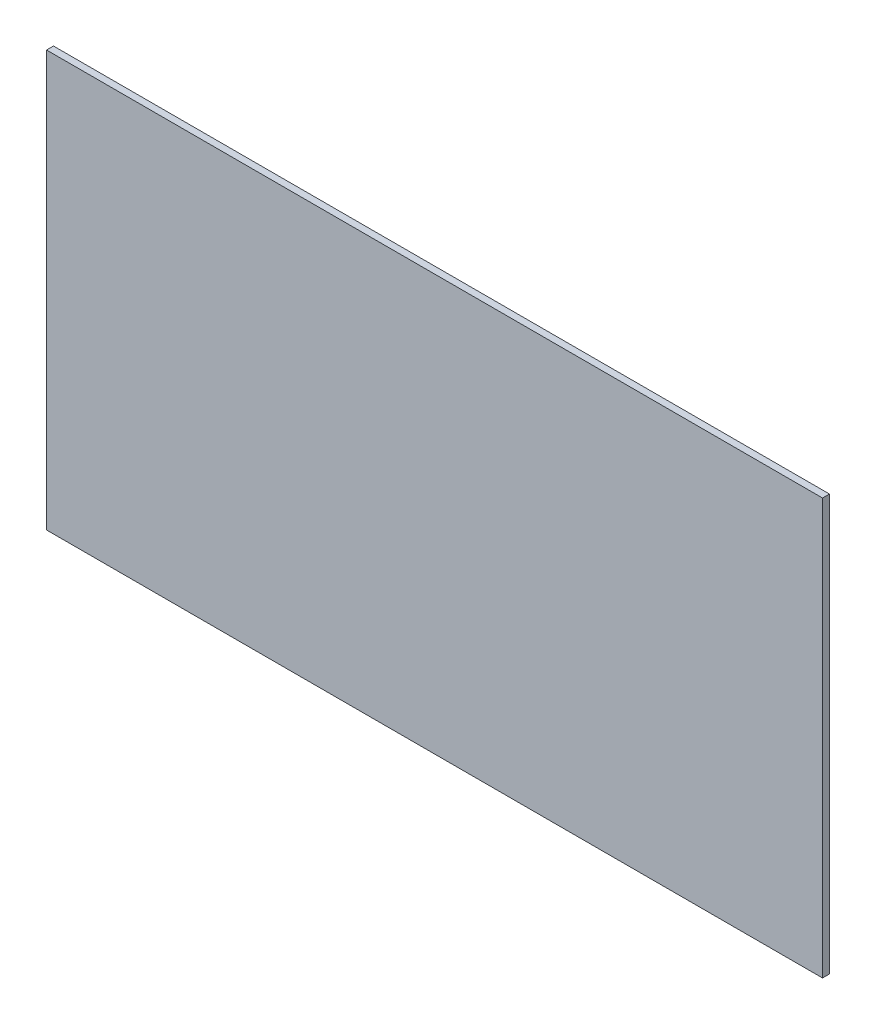
ISO-10303-21;
HEADER;
FILE_DESCRIPTION(('STEP AP214'),'2;1');
FILE_NAME('part.step','',(''),(''),'','','');
FILE_SCHEMA(('AUTOMOTIVE_DESIGN { 1 0 10303 214 1 1 1 1 }'));
ENDSEC;
DATA;
#1=APPLICATION_CONTEXT('core data for automotive mechanical design processes');
#2=APPLICATION_PROTOCOL_DEFINITION('international standard','automotive_design',2000,#1);
#3=PRODUCT_CONTEXT('',#1,'mechanical');
#4=PRODUCT('Part','Part','',(#3));
#5=PRODUCT_RELATED_PRODUCT_CATEGORY('part','',(#4));
#6=PRODUCT_DEFINITION_FORMATION('','',#4);
#7=PRODUCT_DEFINITION_CONTEXT('part definition',#1,'design');
#8=PRODUCT_DEFINITION('design','',#6,#7);
#9=PRODUCT_DEFINITION_SHAPE('','',#8);
#10=(LENGTH_UNIT() NAMED_UNIT(*) SI_UNIT(.MILLI.,.METRE.));
#11=(NAMED_UNIT(*) PLANE_ANGLE_UNIT() SI_UNIT($,.RADIAN.));
#12=(NAMED_UNIT(*) SI_UNIT($,.STERADIAN.) SOLID_ANGLE_UNIT());
#13=UNCERTAINTY_MEASURE_WITH_UNIT(LENGTH_MEASURE(1.E-05),#10,'distance_accuracy_value','');
#14=(GEOMETRIC_REPRESENTATION_CONTEXT(3) GLOBAL_UNCERTAINTY_ASSIGNED_CONTEXT((#13)) GLOBAL_UNIT_ASSIGNED_CONTEXT((#10,
#11,#12)) REPRESENTATION_CONTEXT('',''));
#15=CARTESIAN_POINT('',(0.,0.,0.));
#16=DIRECTION('',(0.,0.,1.));
#17=DIRECTION('',(1.,0.,0.));
#18=AXIS2_PLACEMENT_3D('',#15,#16,#17);
#19=CARTESIAN_POINT('',(0.,0.,2.5));
#20=DIRECTION('',(1.,0.,0.));
#21=DIRECTION('',(0.,0.,-1.));
#22=AXIS2_PLACEMENT_3D('',#19,#20,#21);
#23=PLANE('',#22);
#24=DIRECTION('',(0.,-1.,0.));
#25=VECTOR('',#24,1.);
#26=CARTESIAN_POINT('',(0.,0.,0.));
#27=LINE('',#26,#25);
#28=CARTESIAN_POINT('',(0.,150.,0.));
#29=VERTEX_POINT('',#28);
#30=CARTESIAN_POINT('',(0.,0.,0.));
#31=VERTEX_POINT('',#30);
#32=EDGE_CURVE('E100',#29,#31,#27,.T.);
#33=ORIENTED_EDGE('',*,*,#32,.T.);
#34=DIRECTION('',(0.,0.,-1.));
#35=VECTOR('',#34,1.);
#36=CARTESIAN_POINT('',(0.,0.,2.5));
#37=LINE('',#36,#35);
#38=CARTESIAN_POINT('',(0.,0.,2.5));
#39=VERTEX_POINT('',#38);
#40=EDGE_CURVE('E11',#39,#31,#37,.T.);
#41=ORIENTED_EDGE('',*,*,#40,.F.);
#42=DIRECTION('',(0.,-1.,0.));
#43=VECTOR('',#42,1.);
#44=CARTESIAN_POINT('',(0.,0.,2.5));
#45=LINE('',#44,#43);
#46=CARTESIAN_POINT('',(0.,150.,2.5));
#47=VERTEX_POINT('',#46);
#48=EDGE_CURVE('E88',#47,#39,#45,.T.);
#49=ORIENTED_EDGE('',*,*,#48,.F.);
#50=DIRECTION('',(0.,0.,-1.));
#51=VECTOR('',#50,1.);
#52=CARTESIAN_POINT('',(0.,150.,2.5));
#53=LINE('',#52,#51);
#54=EDGE_CURVE('E96',#47,#29,#53,.T.);
#55=ORIENTED_EDGE('',*,*,#54,.T.);
#56=EDGE_LOOP('',(#33,#41,#49,#55));
#57=FACE_BOUND('',#56,.T.);
#58=ADVANCED_FACE('F37',(#57),#23,.F.);
#59=CARTESIAN_POINT('',(0.,0.,2.5));
#60=DIRECTION('',(0.,1.,0.));
#61=DIRECTION('',(0.,0.,1.));
#62=AXIS2_PLACEMENT_3D('',#59,#60,#61);
#63=PLANE('',#62);
#64=DIRECTION('',(1.,0.,0.));
#65=VECTOR('',#64,1.);
#66=CARTESIAN_POINT('',(0.,0.,0.));
#67=LINE('',#66,#65);
#68=CARTESIAN_POINT('',(280.,0.,0.));
#69=VERTEX_POINT('',#68);
#70=EDGE_CURVE('E92',#31,#69,#67,.T.);
#71=ORIENTED_EDGE('',*,*,#70,.T.);
#72=DIRECTION('',(0.,0.,-1.));
#73=VECTOR('',#72,1.);
#74=CARTESIAN_POINT('',(280.,0.,2.5));
#75=LINE('',#74,#73);
#76=CARTESIAN_POINT('',(280.,0.,2.5));
#77=VERTEX_POINT('',#76);
#78=EDGE_CURVE('E45',#77,#69,#75,.T.);
#79=ORIENTED_EDGE('',*,*,#78,.F.);
#80=DIRECTION('',(1.,0.,0.));
#81=VECTOR('',#80,1.);
#82=CARTESIAN_POINT('',(0.,0.,2.5));
#83=LINE('',#82,#81);
#84=EDGE_CURVE('E83',#39,#77,#83,.T.);
#85=ORIENTED_EDGE('',*,*,#84,.F.);
#86=ORIENTED_EDGE('',*,*,#40,.T.);
#87=EDGE_LOOP('',(#71,#79,#85,#86));
#88=FACE_BOUND('',#87,.T.);
#89=ADVANCED_FACE('F91',(#88),#63,.F.);
#90=CARTESIAN_POINT('',(280.,0.,2.5));
#91=DIRECTION('',(-1.,0.,0.));
#92=DIRECTION('',(0.,0.,1.));
#93=AXIS2_PLACEMENT_3D('',#90,#91,#92);
#94=PLANE('',#93);
#95=DIRECTION('',(0.,1.,0.));
#96=VECTOR('',#95,1.);
#97=CARTESIAN_POINT('',(280.,0.,0.));
#98=LINE('',#97,#96);
#99=CARTESIAN_POINT('',(280.,150.,0.));
#100=VERTEX_POINT('',#99);
#101=EDGE_CURVE('E70',#69,#100,#98,.T.);
#102=ORIENTED_EDGE('',*,*,#101,.T.);
#103=DIRECTION('',(0.,0.,-1.));
#104=VECTOR('',#103,1.);
#105=CARTESIAN_POINT('',(280.,150.,2.5));
#106=LINE('',#105,#104);
#107=CARTESIAN_POINT('',(280.,150.,2.5));
#108=VERTEX_POINT('',#107);
#109=EDGE_CURVE('E93',#108,#100,#106,.T.);
#110=ORIENTED_EDGE('',*,*,#109,.F.);
#111=DIRECTION('',(0.,1.,0.));
#112=VECTOR('',#111,1.);
#113=CARTESIAN_POINT('',(280.,0.,2.5));
#114=LINE('',#113,#112);
#115=EDGE_CURVE('E86',#77,#108,#114,.T.);
#116=ORIENTED_EDGE('',*,*,#115,.F.);
#117=ORIENTED_EDGE('',*,*,#78,.T.);
#118=EDGE_LOOP('',(#102,#110,#116,#117));
#119=FACE_BOUND('',#118,.T.);
#120=ADVANCED_FACE('F94',(#119),#94,.F.);
#121=CARTESIAN_POINT('',(0.,150.,2.5));
#122=DIRECTION('',(0.,-1.,0.));
#123=DIRECTION('',(0.,0.,-1.));
#124=AXIS2_PLACEMENT_3D('',#121,#122,#123);
#125=PLANE('',#124);
#126=DIRECTION('',(-1.,0.,0.));
#127=VECTOR('',#126,1.);
#128=CARTESIAN_POINT('',(0.,150.,0.));
#129=LINE('',#128,#127);
#130=EDGE_CURVE('E76',#100,#29,#129,.T.);
#131=ORIENTED_EDGE('',*,*,#130,.T.);
#132=ORIENTED_EDGE('',*,*,#54,.F.);
#133=DIRECTION('',(-1.,0.,0.));
#134=VECTOR('',#133,1.);
#135=CARTESIAN_POINT('',(0.,150.,2.5));
#136=LINE('',#135,#134);
#137=EDGE_CURVE('E53',#108,#47,#136,.T.);
#138=ORIENTED_EDGE('',*,*,#137,.F.);
#139=ORIENTED_EDGE('',*,*,#109,.T.);
#140=EDGE_LOOP('',(#131,#132,#138,#139));
#141=FACE_BOUND('',#140,.T.);
#142=ADVANCED_FACE('F107',(#141),#125,.F.);
#143=CARTESIAN_POINT('',(0.,0.,2.5));
#144=DIRECTION('',(0.,0.,-1.));
#145=DIRECTION('',(-1.,0.,0.));
#146=AXIS2_PLACEMENT_3D('',#143,#144,#145);
#147=PLANE('',#146);
#148=ORIENTED_EDGE('',*,*,#48,.T.);
#149=ORIENTED_EDGE('',*,*,#84,.T.);
#150=ORIENTED_EDGE('',*,*,#115,.T.);
#151=ORIENTED_EDGE('',*,*,#137,.T.);
#152=EDGE_LOOP('',(#148,#149,#150,#151));
#153=FACE_BOUND('',#152,.T.);
#154=ADVANCED_FACE('F84',(#153),#147,.F.);
#155=CARTESIAN_POINT('',(0.,0.,0.));
#156=DIRECTION('',(0.,0.,-1.));
#157=DIRECTION('',(-1.,0.,0.));
#158=AXIS2_PLACEMENT_3D('',#155,#156,#157);
#159=PLANE('',#158);
#160=ORIENTED_EDGE('',*,*,#32,.F.);
#161=ORIENTED_EDGE('',*,*,#130,.F.);
#162=ORIENTED_EDGE('',*,*,#101,.F.);
#163=ORIENTED_EDGE('',*,*,#70,.F.);
#164=EDGE_LOOP('',(#160,#161,#162,#163));
#165=FACE_BOUND('',#164,.T.);
#166=ADVANCED_FACE('F110',(#165),#159,.T.);
#167=CLOSED_SHELL('',(#58,#89,#120,#142,#154,#166));
#168=MANIFOLD_SOLID_BREP('B2',#167);
#169=ADVANCED_BREP_SHAPE_REPRESENTATION('',(#18,#168),#14);
#170=SHAPE_DEFINITION_REPRESENTATION(#9,#169);
ENDSEC;
END-ISO-10303-21;
